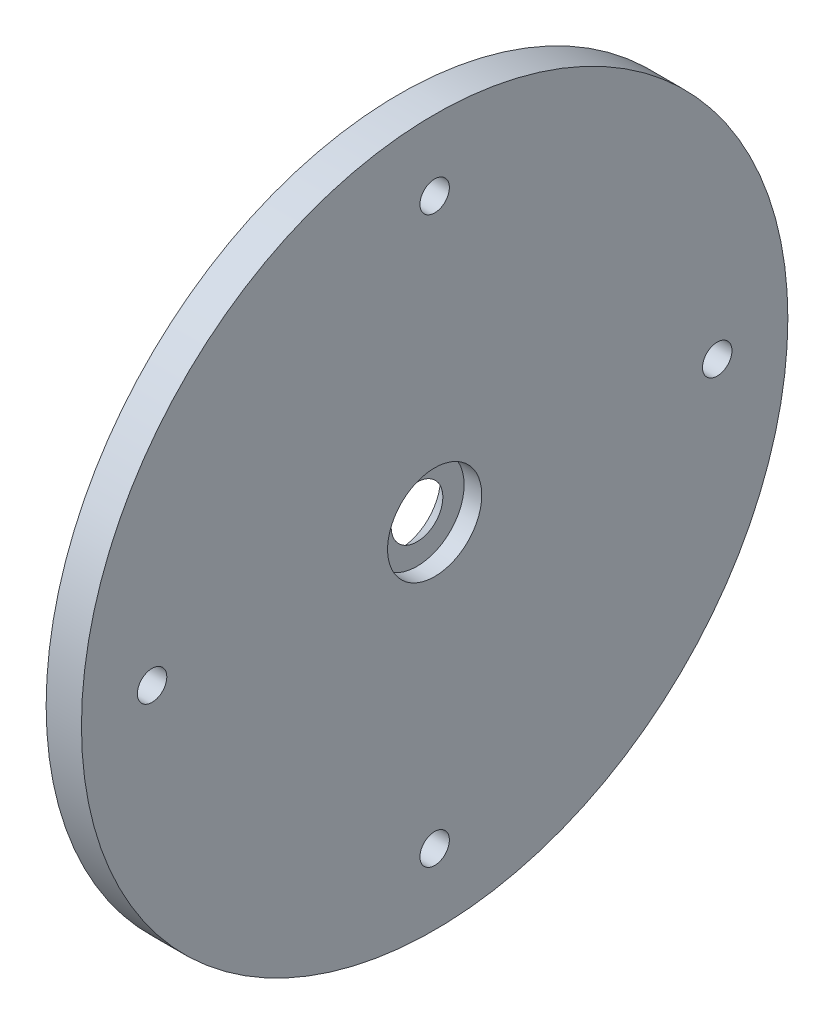
ISO-10303-21;
HEADER;
FILE_DESCRIPTION(('STEP AP214'),'2;1');
FILE_NAME('part.step','',(''),(''),'','','');
FILE_SCHEMA(('AUTOMOTIVE_DESIGN { 1 0 10303 214 1 1 1 1 }'));
ENDSEC;
DATA;
#1=APPLICATION_CONTEXT('core data for automotive mechanical design processes');
#2=APPLICATION_PROTOCOL_DEFINITION('international standard','automotive_design',2000,#1);
#3=PRODUCT_CONTEXT('',#1,'mechanical');
#4=PRODUCT('Part','Part','',(#3));
#5=PRODUCT_RELATED_PRODUCT_CATEGORY('part','',(#4));
#6=PRODUCT_DEFINITION_FORMATION('','',#4);
#7=PRODUCT_DEFINITION_CONTEXT('part definition',#1,'design');
#8=PRODUCT_DEFINITION('design','',#6,#7);
#9=PRODUCT_DEFINITION_SHAPE('','',#8);
#10=(LENGTH_UNIT() NAMED_UNIT(*) SI_UNIT(.MILLI.,.METRE.));
#11=(NAMED_UNIT(*) PLANE_ANGLE_UNIT() SI_UNIT($,.RADIAN.));
#12=(NAMED_UNIT(*) SI_UNIT($,.STERADIAN.) SOLID_ANGLE_UNIT());
#13=UNCERTAINTY_MEASURE_WITH_UNIT(LENGTH_MEASURE(1.E-05),#10,'distance_accuracy_value','');
#14=(GEOMETRIC_REPRESENTATION_CONTEXT(3) GLOBAL_UNCERTAINTY_ASSIGNED_CONTEXT((#13)) GLOBAL_UNIT_ASSIGNED_CONTEXT((#10,
#11,#12)) REPRESENTATION_CONTEXT('',''));
#15=CARTESIAN_POINT('',(0.,0.,0.));
#16=DIRECTION('',(0.,0.,1.));
#17=DIRECTION('',(1.,0.,0.));
#18=AXIS2_PLACEMENT_3D('',#15,#16,#17);
#19=CARTESIAN_POINT('',(9.525,0.,0.));
#20=DIRECTION('',(-1.,0.,0.));
#21=DIRECTION('',(0.,0.,1.));
#22=AXIS2_PLACEMENT_3D('',#19,#20,#21);
#23=CYLINDRICAL_SURFACE('',#22,95.25);
#24=CARTESIAN_POINT('',(9.525,0.,0.));
#25=DIRECTION('',(1.,0.,0.));
#26=DIRECTION('',(0.,0.,-1.));
#27=AXIS2_PLACEMENT_3D('',#24,#25,#26);
#28=CIRCLE('',#27,95.25);
#29=CARTESIAN_POINT('',(9.525,0.,95.25));
#30=VERTEX_POINT('',#29);
#31=EDGE_CURVE('E10',#30,#30,#28,.T.);
#32=CARTESIAN_POINT('',(0.,0.,0.));
#33=DIRECTION('',(1.,0.,0.));
#34=DIRECTION('',(0.,0.,-1.));
#35=AXIS2_PLACEMENT_3D('',#32,#33,#34);
#36=CIRCLE('',#35,95.25);
#37=CARTESIAN_POINT('',(0.,0.,95.25));
#38=VERTEX_POINT('',#37);
#39=EDGE_CURVE('E52',#38,#38,#36,.T.);
#40=CARTESIAN_POINT('',(9.525,0.,95.25));
#41=CARTESIAN_POINT('',(9.42578125,0.,95.25));
#42=CARTESIAN_POINT('',(9.3265625,0.,95.25));
#43=CARTESIAN_POINT('',(9.128125,0.,95.25));
#44=CARTESIAN_POINT('',(9.02890625,0.,95.25));
#45=CARTESIAN_POINT('',(8.83046875,0.,95.25));
#46=CARTESIAN_POINT('',(8.73125,0.,95.25));
#47=CARTESIAN_POINT('',(8.5328125,0.,95.25));
#48=CARTESIAN_POINT('',(8.43359375,0.,95.25));
#49=CARTESIAN_POINT('',(8.23515625,0.,95.25));
#50=CARTESIAN_POINT('',(8.1359375,0.,95.25));
#51=CARTESIAN_POINT('',(7.9375,0.,95.25));
#52=CARTESIAN_POINT('',(7.83828125,0.,95.25));
#53=CARTESIAN_POINT('',(7.63984375,0.,95.25));
#54=CARTESIAN_POINT('',(7.540625,0.,95.25));
#55=CARTESIAN_POINT('',(7.3421875,0.,95.25));
#56=CARTESIAN_POINT('',(7.24296875,0.,95.25));
#57=CARTESIAN_POINT('',(7.04453125,0.,95.25));
#58=CARTESIAN_POINT('',(6.9453125,0.,95.25));
#59=CARTESIAN_POINT('',(6.746875,0.,95.25));
#60=CARTESIAN_POINT('',(6.64765625,0.,95.25));
#61=CARTESIAN_POINT('',(6.44921875,0.,95.25));
#62=CARTESIAN_POINT('',(6.35,0.,95.25));
#63=CARTESIAN_POINT('',(6.1515625,0.,95.25));
#64=CARTESIAN_POINT('',(6.05234375,0.,95.25));
#65=CARTESIAN_POINT('',(5.85390625,0.,95.25));
#66=CARTESIAN_POINT('',(5.7546875,0.,95.25));
#67=CARTESIAN_POINT('',(5.55625,0.,95.25));
#68=CARTESIAN_POINT('',(5.45703125,0.,95.25));
#69=CARTESIAN_POINT('',(5.25859375,0.,95.25));
#70=CARTESIAN_POINT('',(5.159375,0.,95.25));
#71=CARTESIAN_POINT('',(4.9609375,0.,95.25));
#72=CARTESIAN_POINT('',(4.86171875,0.,95.25));
#73=CARTESIAN_POINT('',(4.66328125,0.,95.25));
#74=CARTESIAN_POINT('',(4.5640625,0.,95.25));
#75=CARTESIAN_POINT('',(4.365625,0.,95.25));
#76=CARTESIAN_POINT('',(4.26640625,0.,95.25));
#77=CARTESIAN_POINT('',(4.06796875,0.,95.25));
#78=CARTESIAN_POINT('',(3.96875,0.,95.25));
#79=CARTESIAN_POINT('',(3.7703125,0.,95.25));
#80=CARTESIAN_POINT('',(3.67109375,0.,95.25));
#81=CARTESIAN_POINT('',(3.47265625,0.,95.25));
#82=CARTESIAN_POINT('',(3.3734375,0.,95.25));
#83=CARTESIAN_POINT('',(3.175,0.,95.25));
#84=CARTESIAN_POINT('',(3.07578125,0.,95.25));
#85=CARTESIAN_POINT('',(2.87734375,0.,95.25));
#86=CARTESIAN_POINT('',(2.778125,0.,95.25));
#87=CARTESIAN_POINT('',(2.5796875,0.,95.25));
#88=CARTESIAN_POINT('',(2.48046875,0.,95.25));
#89=CARTESIAN_POINT('',(2.28203125,0.,95.25));
#90=CARTESIAN_POINT('',(2.1828125,0.,95.25));
#91=CARTESIAN_POINT('',(1.984375,0.,95.25));
#92=CARTESIAN_POINT('',(1.88515625,0.,95.25));
#93=CARTESIAN_POINT('',(1.68671875,0.,95.25));
#94=CARTESIAN_POINT('',(1.5875,0.,95.25));
#95=CARTESIAN_POINT('',(1.3890625,0.,95.25));
#96=CARTESIAN_POINT('',(1.28984375,0.,95.25));
#97=CARTESIAN_POINT('',(1.09140625,0.,95.25));
#98=CARTESIAN_POINT('',(0.992187500000001,0.,95.25));
#99=CARTESIAN_POINT('',(0.793750000000001,0.,95.25));
#100=CARTESIAN_POINT('',(0.69453125,0.,95.25));
#101=CARTESIAN_POINT('',(0.49609375,0.,95.25));
#102=CARTESIAN_POINT('',(0.396875,0.,95.25));
#103=CARTESIAN_POINT('',(0.1984375,0.,95.25));
#104=CARTESIAN_POINT('',(0.0992187500000001,0.,95.25));
#105=CARTESIAN_POINT('',(0.,0.,95.25));
#106=B_SPLINE_CURVE_WITH_KNOTS('',3,(#40,#41,#42,#43,#44,#45,#46,#47,#48,#49,#50,#51,#52,#53,
#54,#55,#56,#57,#58,#59,#60,#61,#62,#63,#64,#65,#66,#67,#68,#69,#70,#71,#72,#73,#74,#75,#76,#77,
#78,#79,#80,#81,#82,#83,#84,#85,#86,#87,#88,#89,#90,#91,#92,#93,#94,#95,#96,#97,#98,#99,#100,
#101,#102,#103,#104,#105),.UNSPECIFIED.,.F.,.F.,(4,2,2,2,2,2,2,2,2,2,2,2,2,2,2,2,2,2,2,2,2,2,2,
2,2,2,2,2,2,2,2,2,4),(0.,0.29765625,0.5953125,0.892968750000001,1.190625,1.48828125,1.7859375,
2.08359375,2.38125,2.67890625,2.9765625,3.27421875,3.571875,3.86953125,4.1671875,4.46484375,
4.7625,5.06015625,5.3578125,5.65546875,5.953125,6.25078125,6.5484375,6.84609375,7.14375,
7.44140625,7.7390625,8.03671875,8.334375,8.63203125,8.9296875,9.22734375,9.525),.UNSPECIFIED.);
#107=EDGE_CURVE('BSEAM45',#30,#38,#106,.T.);
#108=ORIENTED_EDGE('',*,*,#31,.F.);
#109=ORIENTED_EDGE('',*,*,#39,.T.);
#110=ORIENTED_EDGE('',*,*,#107,.T.);
#111=ORIENTED_EDGE('',*,*,#107,.F.);
#112=EDGE_LOOP('',(#108,#110,#109,#111));
#113=FACE_BOUND('',#112,.T.);
#114=ADVANCED_FACE('F45',(#113),#23,.T.);
#115=CARTESIAN_POINT('',(9.525,0.,0.));
#116=DIRECTION('',(1.,0.,0.));
#117=DIRECTION('',(0.,0.,-1.));
#118=AXIS2_PLACEMENT_3D('',#115,#116,#117);
#119=PLANE('',#118);
#120=CARTESIAN_POINT('',(9.525,-8.07484442669043E-13,76.2));
#121=DIRECTION('',(1.,0.,0.));
#122=DIRECTION('',(0.,0.,-1.));
#123=AXIS2_PLACEMENT_3D('',#120,#121,#122);
#124=CIRCLE('',#123,3.96874999999999);
#125=CARTESIAN_POINT('',(9.525,-8.07484442669043E-13,72.23125));
#126=VERTEX_POINT('',#125);
#127=EDGE_CURVE('E88',#126,#126,#124,.T.);
#128=ORIENTED_EDGE('',*,*,#127,.F.);
#129=EDGE_LOOP('',(#128));
#130=FACE_BOUND('',#129,.T.);
#131=CARTESIAN_POINT('',(9.525,76.2,0.));
#132=DIRECTION('',(1.,0.,0.));
#133=DIRECTION('',(0.,0.,-1.));
#134=AXIS2_PLACEMENT_3D('',#131,#132,#133);
#135=CIRCLE('',#134,3.96874999999999);
#136=CARTESIAN_POINT('',(9.525,76.2,-3.96874999999998));
#137=VERTEX_POINT('',#136);
#138=EDGE_CURVE('E82',#137,#137,#135,.T.);
#139=ORIENTED_EDGE('',*,*,#138,.F.);
#140=EDGE_LOOP('',(#139));
#141=FACE_BOUND('',#140,.T.);
#142=CARTESIAN_POINT('',(9.525,2.7538268662935E-13,-76.2));
#143=DIRECTION('',(1.,0.,0.));
#144=DIRECTION('',(0.,0.,-1.));
#145=AXIS2_PLACEMENT_3D('',#142,#143,#144);
#146=CIRCLE('',#145,3.96874999999999);
#147=CARTESIAN_POINT('',(9.525,2.7538268662935E-13,-80.16875));
#148=VERTEX_POINT('',#147);
#149=EDGE_CURVE('E76',#148,#148,#146,.T.);
#150=ORIENTED_EDGE('',*,*,#149,.F.);
#151=EDGE_LOOP('',(#150));
#152=FACE_BOUND('',#151,.T.);
#153=CARTESIAN_POINT('',(9.525,-76.2,0.));
#154=DIRECTION('',(1.,0.,0.));
#155=DIRECTION('',(0.,0.,-1.));
#156=AXIS2_PLACEMENT_3D('',#153,#154,#155);
#157=CIRCLE('',#156,3.96874999999999);
#158=CARTESIAN_POINT('',(9.525,-76.2,-3.96875));
#159=VERTEX_POINT('',#158);
#160=EDGE_CURVE('E70',#159,#159,#157,.T.);
#161=ORIENTED_EDGE('',*,*,#160,.F.);
#162=EDGE_LOOP('',(#161));
#163=FACE_BOUND('',#162,.T.);
#164=CARTESIAN_POINT('',(9.525,0.,0.));
#165=DIRECTION('',(1.,0.,0.));
#166=DIRECTION('',(0.,0.,-1.));
#167=AXIS2_PLACEMENT_3D('',#164,#165,#166);
#168=CIRCLE('',#167,12.7);
#169=CARTESIAN_POINT('',(9.525,0.,-12.7));
#170=VERTEX_POINT('',#169);
#171=EDGE_CURVE('E59',#170,#170,#168,.T.);
#172=ORIENTED_EDGE('',*,*,#171,.F.);
#173=EDGE_LOOP('',(#172));
#174=FACE_BOUND('',#173,.T.);
#175=ORIENTED_EDGE('',*,*,#31,.T.);
#176=EDGE_LOOP('',(#175));
#177=FACE_BOUND('',#176,.T.);
#178=ADVANCED_FACE('F94',(#130,#141,#152,#163,#174,#177),#119,.T.);
#179=CARTESIAN_POINT('',(0.,0.,0.));
#180=DIRECTION('',(1.,0.,0.));
#181=DIRECTION('',(0.,0.,-1.));
#182=AXIS2_PLACEMENT_3D('',#179,#180,#181);
#183=PLANE('',#182);
#184=CARTESIAN_POINT('',(0.,-8.07484442669043E-13,76.2));
#185=DIRECTION('',(1.,0.,0.));
#186=DIRECTION('',(0.,0.,-1.));
#187=AXIS2_PLACEMENT_3D('',#184,#185,#186);
#188=CIRCLE('',#187,3.96875);
#189=CARTESIAN_POINT('',(0.,-8.07484442669043E-13,72.23125));
#190=VERTEX_POINT('',#189);
#191=EDGE_CURVE('E85',#190,#190,#188,.T.);
#192=ORIENTED_EDGE('',*,*,#191,.T.);
#193=EDGE_LOOP('',(#192));
#194=FACE_BOUND('',#193,.T.);
#195=CARTESIAN_POINT('',(0.,76.2,0.));
#196=DIRECTION('',(1.,0.,0.));
#197=DIRECTION('',(0.,0.,-1.));
#198=AXIS2_PLACEMENT_3D('',#195,#196,#197);
#199=CIRCLE('',#198,3.96874999999999);
#200=CARTESIAN_POINT('',(0.,76.2,-3.96874999999998));
#201=VERTEX_POINT('',#200);
#202=EDGE_CURVE('E79',#201,#201,#199,.T.);
#203=ORIENTED_EDGE('',*,*,#202,.T.);
#204=EDGE_LOOP('',(#203));
#205=FACE_BOUND('',#204,.T.);
#206=CARTESIAN_POINT('',(0.,2.7538268662935E-13,-76.2));
#207=DIRECTION('',(1.,0.,0.));
#208=DIRECTION('',(0.,0.,-1.));
#209=AXIS2_PLACEMENT_3D('',#206,#207,#208);
#210=CIRCLE('',#209,3.96875);
#211=CARTESIAN_POINT('',(0.,2.7538268662935E-13,-80.16875));
#212=VERTEX_POINT('',#211);
#213=EDGE_CURVE('E73',#212,#212,#210,.T.);
#214=ORIENTED_EDGE('',*,*,#213,.T.);
#215=EDGE_LOOP('',(#214));
#216=FACE_BOUND('',#215,.T.);
#217=CARTESIAN_POINT('',(0.,-76.2,0.));
#218=DIRECTION('',(1.,0.,0.));
#219=DIRECTION('',(0.,0.,-1.));
#220=AXIS2_PLACEMENT_3D('',#217,#218,#219);
#221=CIRCLE('',#220,3.96874999999999);
#222=CARTESIAN_POINT('',(0.,-76.2,-3.96875));
#223=VERTEX_POINT('',#222);
#224=EDGE_CURVE('E67',#223,#223,#221,.T.);
#225=ORIENTED_EDGE('',*,*,#224,.T.);
#226=EDGE_LOOP('',(#225));
#227=FACE_BOUND('',#226,.T.);
#228=CARTESIAN_POINT('',(0.,0.,0.));
#229=DIRECTION('',(-1.,0.,0.));
#230=DIRECTION('',(0.,0.,1.));
#231=AXIS2_PLACEMENT_3D('',#228,#229,#230);
#232=CIRCLE('',#231,11.1125);
#233=CARTESIAN_POINT('',(0.,0.,11.1125));
#234=VERTEX_POINT('',#233);
#235=EDGE_CURVE('E64',#234,#234,#232,.T.);
#236=ORIENTED_EDGE('',*,*,#235,.F.);
#237=EDGE_LOOP('',(#236));
#238=FACE_BOUND('',#237,.T.);
#239=ORIENTED_EDGE('',*,*,#39,.F.);
#240=EDGE_LOOP('',(#239));
#241=FACE_BOUND('',#240,.T.);
#242=ADVANCED_FACE('F97',(#194,#205,#216,#227,#238,#241),#183,.F.);
#243=CARTESIAN_POINT('',(4.7625,0.,0.));
#244=DIRECTION('',(1.,0.,0.));
#245=DIRECTION('',(0.,0.,-1.));
#246=AXIS2_PLACEMENT_3D('',#243,#244,#245);
#247=CYLINDRICAL_SURFACE('',#246,12.7);
#248=CARTESIAN_POINT('',(4.7625,0.,0.));
#249=DIRECTION('',(1.,0.,0.));
#250=DIRECTION('',(0.,0.,-1.));
#251=AXIS2_PLACEMENT_3D('',#248,#249,#250);
#252=CIRCLE('',#251,12.7);
#253=CARTESIAN_POINT('',(4.7625,0.,-12.7));
#254=VERTEX_POINT('',#253);
#255=EDGE_CURVE('E57',#254,#254,#252,.T.);
#256=CARTESIAN_POINT('',(4.7625,0.,-12.7));
#257=CARTESIAN_POINT('',(4.812109375,0.,-12.7));
#258=CARTESIAN_POINT('',(4.86171875,0.,-12.7));
#259=CARTESIAN_POINT('',(4.9609375,0.,-12.7));
#260=CARTESIAN_POINT('',(5.010546875,0.,-12.7));
#261=CARTESIAN_POINT('',(5.109765625,0.,-12.7));
#262=CARTESIAN_POINT('',(5.159375,0.,-12.7));
#263=CARTESIAN_POINT('',(5.25859375,0.,-12.7));
#264=CARTESIAN_POINT('',(5.308203125,0.,-12.7));
#265=CARTESIAN_POINT('',(5.407421875,0.,-12.7));
#266=CARTESIAN_POINT('',(5.45703125,0.,-12.7));
#267=CARTESIAN_POINT('',(5.55625,0.,-12.7));
#268=CARTESIAN_POINT('',(5.605859375,0.,-12.7));
#269=CARTESIAN_POINT('',(5.705078125,0.,-12.7));
#270=CARTESIAN_POINT('',(5.7546875,0.,-12.7));
#271=CARTESIAN_POINT('',(5.85390625,0.,-12.7));
#272=CARTESIAN_POINT('',(5.903515625,0.,-12.7));
#273=CARTESIAN_POINT('',(6.002734375,0.,-12.7));
#274=CARTESIAN_POINT('',(6.05234375,0.,-12.7));
#275=CARTESIAN_POINT('',(6.1515625,0.,-12.7));
#276=CARTESIAN_POINT('',(6.201171875,0.,-12.7));
#277=CARTESIAN_POINT('',(6.300390625,0.,-12.7));
#278=CARTESIAN_POINT('',(6.35,0.,-12.7));
#279=CARTESIAN_POINT('',(6.44921875,0.,-12.7));
#280=CARTESIAN_POINT('',(6.498828125,0.,-12.7));
#281=CARTESIAN_POINT('',(6.598046875,0.,-12.7));
#282=CARTESIAN_POINT('',(6.64765625,0.,-12.7));
#283=CARTESIAN_POINT('',(6.746875,0.,-12.7));
#284=CARTESIAN_POINT('',(6.796484375,0.,-12.7));
#285=CARTESIAN_POINT('',(6.895703125,0.,-12.7));
#286=CARTESIAN_POINT('',(6.9453125,0.,-12.7));
#287=CARTESIAN_POINT('',(7.04453125,0.,-12.7));
#288=CARTESIAN_POINT('',(7.094140625,0.,-12.7));
#289=CARTESIAN_POINT('',(7.193359375,0.,-12.7));
#290=CARTESIAN_POINT('',(7.24296875,0.,-12.7));
#291=CARTESIAN_POINT('',(7.3421875,0.,-12.7));
#292=CARTESIAN_POINT('',(7.391796875,0.,-12.7));
#293=CARTESIAN_POINT('',(7.491015625,0.,-12.7));
#294=CARTESIAN_POINT('',(7.540625,0.,-12.7));
#295=CARTESIAN_POINT('',(7.63984375,0.,-12.7));
#296=CARTESIAN_POINT('',(7.689453125,0.,-12.7));
#297=CARTESIAN_POINT('',(7.788671875,0.,-12.7));
#298=CARTESIAN_POINT('',(7.83828125,0.,-12.7));
#299=CARTESIAN_POINT('',(7.9375,0.,-12.7));
#300=CARTESIAN_POINT('',(7.987109375,0.,-12.7));
#301=CARTESIAN_POINT('',(8.086328125,0.,-12.7));
#302=CARTESIAN_POINT('',(8.1359375,0.,-12.7));
#303=CARTESIAN_POINT('',(8.23515625,0.,-12.7));
#304=CARTESIAN_POINT('',(8.284765625,0.,-12.7));
#305=CARTESIAN_POINT('',(8.383984375,0.,-12.7));
#306=CARTESIAN_POINT('',(8.43359375,0.,-12.7));
#307=CARTESIAN_POINT('',(8.5328125,0.,-12.7));
#308=CARTESIAN_POINT('',(8.582421875,0.,-12.7));
#309=CARTESIAN_POINT('',(8.681640625,0.,-12.7));
#310=CARTESIAN_POINT('',(8.73125,0.,-12.7));
#311=CARTESIAN_POINT('',(8.83046875,0.,-12.7));
#312=CARTESIAN_POINT('',(8.880078125,0.,-12.7));
#313=CARTESIAN_POINT('',(8.979296875,0.,-12.7));
#314=CARTESIAN_POINT('',(9.02890625,0.,-12.7));
#315=CARTESIAN_POINT('',(9.128125,0.,-12.7));
#316=CARTESIAN_POINT('',(9.177734375,0.,-12.7));
#317=CARTESIAN_POINT('',(9.276953125,0.,-12.7));
#318=CARTESIAN_POINT('',(9.3265625,0.,-12.7));
#319=CARTESIAN_POINT('',(9.42578125,0.,-12.7));
#320=CARTESIAN_POINT('',(9.475390625,0.,-12.7));
#321=CARTESIAN_POINT('',(9.525,0.,-12.7));
#322=B_SPLINE_CURVE_WITH_KNOTS('',3,(#256,#257,#258,#259,#260,#261,#262,#263,#264,#265,#266,
#267,#268,#269,#270,#271,#272,#273,#274,#275,#276,#277,#278,#279,#280,#281,#282,#283,#284,#285,
#286,#287,#288,#289,#290,#291,#292,#293,#294,#295,#296,#297,#298,#299,#300,#301,#302,#303,#304,
#305,#306,#307,#308,#309,#310,#311,#312,#313,#314,#315,#316,#317,#318,#319,#320,#321),
.UNSPECIFIED.,.F.,.F.,(4,2,2,2,2,2,2,2,2,2,2,2,2,2,2,2,2,2,2,2,2,2,2,2,2,2,2,2,2,2,2,2,4),(0.,
0.148828125,0.29765625,0.446484375,0.5953125,0.744140625,0.892968750000001,1.041796875,1.190625,
1.339453125,1.48828125,1.637109375,1.7859375,1.934765625,2.08359375,2.232421875,2.38125,
2.530078125,2.67890625,2.827734375,2.9765625,3.125390625,3.27421875,3.423046875,3.571875,
3.720703125,3.86953125,4.018359375,4.1671875,4.316015625,4.46484375,4.613671875,4.7625),.UNSPECIFIED.);
#323=EDGE_CURVE('BSEAM107',#254,#170,#322,.T.);
#324=ORIENTED_EDGE('',*,*,#255,.F.);
#325=ORIENTED_EDGE('',*,*,#171,.T.);
#326=ORIENTED_EDGE('',*,*,#323,.T.);
#327=ORIENTED_EDGE('',*,*,#323,.F.);
#328=EDGE_LOOP('',(#324,#326,#325,#327));
#329=FACE_BOUND('',#328,.T.);
#330=ADVANCED_FACE('F107',(#329),#247,.F.);
#331=CARTESIAN_POINT('',(4.7625,0.,0.));
#332=DIRECTION('',(1.,0.,0.));
#333=DIRECTION('',(0.,0.,-1.));
#334=AXIS2_PLACEMENT_3D('',#331,#332,#333);
#335=PLANE('',#334);
#336=CARTESIAN_POINT('',(4.7625,0.,0.));
#337=DIRECTION('',(1.,0.,0.));
#338=DIRECTION('',(0.,0.,-1.));
#339=AXIS2_PLACEMENT_3D('',#336,#337,#338);
#340=CIRCLE('',#339,6.97252191115023);
#341=CARTESIAN_POINT('',(4.7625,0.,-6.97252191115023));
#342=VERTEX_POINT('',#341);
#343=EDGE_CURVE('E48',#342,#342,#340,.T.);
#344=ORIENTED_EDGE('',*,*,#343,.F.);
#345=EDGE_LOOP('',(#344));
#346=FACE_BOUND('',#345,.T.);
#347=ORIENTED_EDGE('',*,*,#255,.T.);
#348=EDGE_LOOP('',(#347));
#349=FACE_BOUND('',#348,.T.);
#350=ADVANCED_FACE('F109',(#346,#349),#335,.T.);
#351=CARTESIAN_POINT('',(0.,0.,0.));
#352=DIRECTION('',(-1.,0.,0.));
#353=DIRECTION('',(0.,0.,1.));
#354=AXIS2_PLACEMENT_3D('',#351,#352,#353);
#355=CONICAL_SURFACE('',#354,11.1125,0.715584993317674);
#356=ORIENTED_EDGE('',*,*,#343,.T.);
#357=EDGE_LOOP('',(#356));
#358=FACE_BOUND('',#357,.T.);
#359=ORIENTED_EDGE('',*,*,#235,.T.);
#360=EDGE_LOOP('',(#359));
#361=FACE_BOUND('',#360,.T.);
#362=ADVANCED_FACE('F116',(#358,#361),#355,.F.);
#363=CARTESIAN_POINT('',(9.525,-76.2,0.));
#364=DIRECTION('',(1.,0.,0.));
#365=DIRECTION('',(0.,0.,-1.));
#366=AXIS2_PLACEMENT_3D('',#363,#364,#365);
#367=CYLINDRICAL_SURFACE('',#366,3.96874999999999);
#368=ORIENTED_EDGE('',*,*,#224,.F.);
#369=EDGE_LOOP('',(#368));
#370=FACE_BOUND('',#369,.T.);
#371=ORIENTED_EDGE('',*,*,#160,.T.);
#372=EDGE_LOOP('',(#371));
#373=FACE_BOUND('',#372,.T.);
#374=ADVANCED_FACE('F153',(#370,#373),#367,.F.);
#375=CARTESIAN_POINT('',(9.525,2.7538268662935E-13,-76.2));
#376=DIRECTION('',(1.,0.,0.));
#377=DIRECTION('',(0.,0.,-1.));
#378=AXIS2_PLACEMENT_3D('',#375,#376,#377);
#379=CYLINDRICAL_SURFACE('',#378,3.96874999999999);
#380=ORIENTED_EDGE('',*,*,#213,.F.);
#381=EDGE_LOOP('',(#380));
#382=FACE_BOUND('',#381,.T.);
#383=ORIENTED_EDGE('',*,*,#149,.T.);
#384=EDGE_LOOP('',(#383));
#385=FACE_BOUND('',#384,.T.);
#386=ADVANCED_FACE('F162',(#382,#385),#379,.F.);
#387=CARTESIAN_POINT('',(9.525,76.2,0.));
#388=DIRECTION('',(1.,0.,0.));
#389=DIRECTION('',(0.,0.,-1.));
#390=AXIS2_PLACEMENT_3D('',#387,#388,#389);
#391=CYLINDRICAL_SURFACE('',#390,3.96874999999999);
#392=ORIENTED_EDGE('',*,*,#202,.F.);
#393=EDGE_LOOP('',(#392));
#394=FACE_BOUND('',#393,.T.);
#395=ORIENTED_EDGE('',*,*,#138,.T.);
#396=EDGE_LOOP('',(#395));
#397=FACE_BOUND('',#396,.T.);
#398=ADVANCED_FACE('F171',(#394,#397),#391,.F.);
#399=CARTESIAN_POINT('',(9.525,-8.07484442669043E-13,76.2));
#400=DIRECTION('',(1.,0.,0.));
#401=DIRECTION('',(0.,0.,-1.));
#402=AXIS2_PLACEMENT_3D('',#399,#400,#401);
#403=CYLINDRICAL_SURFACE('',#402,3.96874999999999);
#404=ORIENTED_EDGE('',*,*,#191,.F.);
#405=EDGE_LOOP('',(#404));
#406=FACE_BOUND('',#405,.T.);
#407=ORIENTED_EDGE('',*,*,#127,.T.);
#408=EDGE_LOOP('',(#407));
#409=FACE_BOUND('',#408,.T.);
#410=ADVANCED_FACE('F92',(#406,#409),#403,.F.);
#411=CLOSED_SHELL('',(#114,#178,#242,#330,#350,#362,#374,#386,#398,#410));
#412=MANIFOLD_SOLID_BREP('B2',#411);
#413=ADVANCED_BREP_SHAPE_REPRESENTATION('',(#18,#412),#14);
#414=SHAPE_DEFINITION_REPRESENTATION(#9,#413);
ENDSEC;
END-ISO-10303-21;
